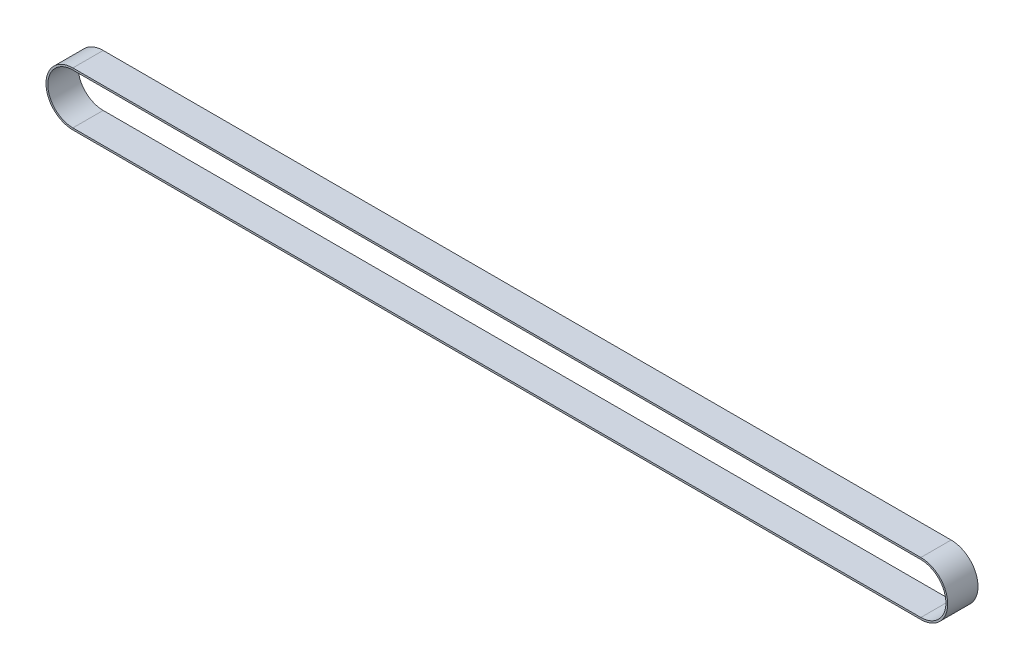
ISO-10303-21;
HEADER;
FILE_DESCRIPTION(('STEP AP214'),'2;1');
FILE_NAME('part.step','',(''),(''),'','','');
FILE_SCHEMA(('AUTOMOTIVE_DESIGN { 1 0 10303 214 1 1 1 1 }'));
ENDSEC;
DATA;
#1=APPLICATION_CONTEXT('core data for automotive mechanical design processes');
#2=APPLICATION_PROTOCOL_DEFINITION('international standard','automotive_design',2000,#1);
#3=PRODUCT_CONTEXT('',#1,'mechanical');
#4=PRODUCT('Part','Part','',(#3));
#5=PRODUCT_RELATED_PRODUCT_CATEGORY('part','',(#4));
#6=PRODUCT_DEFINITION_FORMATION('','',#4);
#7=PRODUCT_DEFINITION_CONTEXT('part definition',#1,'design');
#8=PRODUCT_DEFINITION('design','',#6,#7);
#9=PRODUCT_DEFINITION_SHAPE('','',#8);
#10=(LENGTH_UNIT() NAMED_UNIT(*) SI_UNIT(.MILLI.,.METRE.));
#11=(NAMED_UNIT(*) PLANE_ANGLE_UNIT() SI_UNIT($,.RADIAN.));
#12=(NAMED_UNIT(*) SI_UNIT($,.STERADIAN.) SOLID_ANGLE_UNIT());
#13=UNCERTAINTY_MEASURE_WITH_UNIT(LENGTH_MEASURE(1.E-05),#10,'distance_accuracy_value','');
#14=(GEOMETRIC_REPRESENTATION_CONTEXT(3) GLOBAL_UNCERTAINTY_ASSIGNED_CONTEXT((#13)) GLOBAL_UNIT_ASSIGNED_CONTEXT((#10,
#11,#12)) REPRESENTATION_CONTEXT('',''));
#15=CARTESIAN_POINT('',(0.,0.,0.));
#16=DIRECTION('',(0.,0.,1.));
#17=DIRECTION('',(1.,0.,0.));
#18=AXIS2_PLACEMENT_3D('',#15,#16,#17);
#19=CARTESIAN_POINT('',(0.,0.,25.));
#20=DIRECTION('',(0.,0.,1.));
#21=DIRECTION('',(1.,0.,0.));
#22=AXIS2_PLACEMENT_3D('',#19,#20,#21);
#23=PLANE('',#22);
#24=CARTESIAN_POINT('',(0.,0.,25.));
#25=DIRECTION('',(0.,0.,1.));
#26=DIRECTION('',(1.,0.,0.));
#27=AXIS2_PLACEMENT_3D('',#24,#25,#26);
#28=CIRCLE('',#27,22.19);
#29=CARTESIAN_POINT('',(0.,22.19,25.));
#30=VERTEX_POINT('',#29);
#31=CARTESIAN_POINT('',(0.,-22.19,25.));
#32=VERTEX_POINT('',#31);
#33=EDGE_CURVE('E180',#30,#32,#28,.T.);
#34=ORIENTED_EDGE('',*,*,#33,.T.);
#35=DIRECTION('',(1.,0.,0.));
#36=VECTOR('',#35,1.);
#37=CARTESIAN_POINT('',(0.,-22.19,25.));
#38=LINE('',#37,#36);
#39=CARTESIAN_POINT('',(700.,-22.19,25.));
#40=VERTEX_POINT('',#39);
#41=EDGE_CURVE('E184',#32,#40,#38,.T.);
#42=ORIENTED_EDGE('',*,*,#41,.T.);
#43=CARTESIAN_POINT('',(700.,0.,25.));
#44=DIRECTION('',(0.,0.,1.));
#45=DIRECTION('',(1.,0.,0.));
#46=AXIS2_PLACEMENT_3D('',#43,#44,#45);
#47=CIRCLE('',#46,22.19);
#48=CARTESIAN_POINT('',(700.,22.19,25.));
#49=VERTEX_POINT('',#48);
#50=EDGE_CURVE('E188',#40,#49,#47,.T.);
#51=ORIENTED_EDGE('',*,*,#50,.T.);
#52=DIRECTION('',(-1.,0.,0.));
#53=VECTOR('',#52,1.);
#54=CARTESIAN_POINT('',(0.,22.19,25.));
#55=LINE('',#54,#53);
#56=EDGE_CURVE('E191',#49,#30,#55,.T.);
#57=ORIENTED_EDGE('',*,*,#56,.T.);
#58=EDGE_LOOP('',(#34,#42,#51,#57));
#59=FACE_BOUND('',#58,.T.);
#60=DIRECTION('',(1.,0.,0.));
#61=VECTOR('',#60,1.);
#62=CARTESIAN_POINT('',(0.,-20.69,25.));
#63=LINE('',#62,#61);
#64=CARTESIAN_POINT('',(0.,-20.69,25.));
#65=VERTEX_POINT('',#64);
#66=CARTESIAN_POINT('',(700.,-20.69,25.));
#67=VERTEX_POINT('',#66);
#68=EDGE_CURVE('E141',#65,#67,#63,.T.);
#69=ORIENTED_EDGE('',*,*,#68,.F.);
#70=CARTESIAN_POINT('',(0.,0.,25.));
#71=DIRECTION('',(0.,0.,1.));
#72=DIRECTION('',(1.,0.,0.));
#73=AXIS2_PLACEMENT_3D('',#70,#71,#72);
#74=CIRCLE('',#73,20.69);
#75=CARTESIAN_POINT('',(0.,20.69,25.));
#76=VERTEX_POINT('',#75);
#77=EDGE_CURVE('E132',#76,#65,#74,.T.);
#78=ORIENTED_EDGE('',*,*,#77,.F.);
#79=DIRECTION('',(-1.,0.,0.));
#80=VECTOR('',#79,1.);
#81=CARTESIAN_POINT('',(0.,20.69,25.));
#82=LINE('',#81,#80);
#83=CARTESIAN_POINT('',(700.,20.69,25.));
#84=VERTEX_POINT('',#83);
#85=EDGE_CURVE('E158',#84,#76,#82,.T.);
#86=ORIENTED_EDGE('',*,*,#85,.F.);
#87=CARTESIAN_POINT('',(700.,0.,25.));
#88=DIRECTION('',(0.,0.,1.));
#89=DIRECTION('',(1.,0.,0.));
#90=AXIS2_PLACEMENT_3D('',#87,#88,#89);
#91=CIRCLE('',#90,20.69);
#92=EDGE_CURVE('E154',#67,#84,#91,.T.);
#93=ORIENTED_EDGE('',*,*,#92,.F.);
#94=EDGE_LOOP('',(#69,#78,#86,#93));
#95=FACE_BOUND('',#94,.T.);
#96=ADVANCED_FACE('F66',(#59,#95),#23,.T.);
#97=CARTESIAN_POINT('',(0.,0.,0.));
#98=DIRECTION('',(0.,0.,1.));
#99=DIRECTION('',(1.,0.,0.));
#100=AXIS2_PLACEMENT_3D('',#97,#98,#99);
#101=PLANE('',#100);
#102=CARTESIAN_POINT('',(0.,0.,0.));
#103=DIRECTION('',(0.,0.,1.));
#104=DIRECTION('',(1.,0.,0.));
#105=AXIS2_PLACEMENT_3D('',#102,#103,#104);
#106=CIRCLE('',#105,22.19);
#107=CARTESIAN_POINT('',(0.,22.19,0.));
#108=VERTEX_POINT('',#107);
#109=CARTESIAN_POINT('',(0.,-22.19,0.));
#110=VERTEX_POINT('',#109);
#111=EDGE_CURVE('E150',#108,#110,#106,.T.);
#112=ORIENTED_EDGE('',*,*,#111,.F.);
#113=DIRECTION('',(-1.,0.,0.));
#114=VECTOR('',#113,1.);
#115=CARTESIAN_POINT('',(0.,22.19,0.));
#116=LINE('',#115,#114);
#117=CARTESIAN_POINT('',(700.,22.19,0.));
#118=VERTEX_POINT('',#117);
#119=EDGE_CURVE('E185',#118,#108,#116,.T.);
#120=ORIENTED_EDGE('',*,*,#119,.F.);
#121=CARTESIAN_POINT('',(700.,0.,0.));
#122=DIRECTION('',(0.,0.,1.));
#123=DIRECTION('',(1.,0.,0.));
#124=AXIS2_PLACEMENT_3D('',#121,#122,#123);
#125=CIRCLE('',#124,22.19);
#126=CARTESIAN_POINT('',(700.,-22.19,0.));
#127=VERTEX_POINT('',#126);
#128=EDGE_CURVE('E201',#127,#118,#125,.T.);
#129=ORIENTED_EDGE('',*,*,#128,.F.);
#130=DIRECTION('',(1.,0.,0.));
#131=VECTOR('',#130,1.);
#132=CARTESIAN_POINT('',(0.,-22.19,0.));
#133=LINE('',#132,#131);
#134=EDGE_CURVE('E198',#110,#127,#133,.T.);
#135=ORIENTED_EDGE('',*,*,#134,.F.);
#136=EDGE_LOOP('',(#112,#120,#129,#135));
#137=FACE_BOUND('',#136,.T.);
#138=CARTESIAN_POINT('',(0.,0.,0.));
#139=DIRECTION('',(0.,0.,1.));
#140=DIRECTION('',(1.,0.,0.));
#141=AXIS2_PLACEMENT_3D('',#138,#139,#140);
#142=CIRCLE('',#141,20.69);
#143=CARTESIAN_POINT('',(0.,20.69,0.));
#144=VERTEX_POINT('',#143);
#145=CARTESIAN_POINT('',(0.,-20.69,0.));
#146=VERTEX_POINT('',#145);
#147=EDGE_CURVE('E90',#144,#146,#142,.T.);
#148=ORIENTED_EDGE('',*,*,#147,.T.);
#149=DIRECTION('',(1.,0.,0.));
#150=VECTOR('',#149,1.);
#151=CARTESIAN_POINT('',(0.,-20.69,0.));
#152=LINE('',#151,#150);
#153=CARTESIAN_POINT('',(700.,-20.69,0.));
#154=VERTEX_POINT('',#153);
#155=EDGE_CURVE('E148',#146,#154,#152,.T.);
#156=ORIENTED_EDGE('',*,*,#155,.T.);
#157=CARTESIAN_POINT('',(700.,0.,0.));
#158=DIRECTION('',(0.,0.,1.));
#159=DIRECTION('',(1.,0.,0.));
#160=AXIS2_PLACEMENT_3D('',#157,#158,#159);
#161=CIRCLE('',#160,20.69);
#162=CARTESIAN_POINT('',(700.,20.69,0.));
#163=VERTEX_POINT('',#162);
#164=EDGE_CURVE('E167',#154,#163,#161,.T.);
#165=ORIENTED_EDGE('',*,*,#164,.T.);
#166=DIRECTION('',(-1.,0.,0.));
#167=VECTOR('',#166,1.);
#168=CARTESIAN_POINT('',(0.,20.69,0.));
#169=LINE('',#168,#167);
#170=EDGE_CURVE('E142',#163,#144,#169,.T.);
#171=ORIENTED_EDGE('',*,*,#170,.T.);
#172=EDGE_LOOP('',(#148,#156,#165,#171));
#173=FACE_BOUND('',#172,.T.);
#174=ADVANCED_FACE('F224',(#137,#173),#101,.F.);
#175=CARTESIAN_POINT('',(0.,0.,25.));
#176=DIRECTION('',(0.,0.,-1.));
#177=DIRECTION('',(-1.,0.,0.));
#178=AXIS2_PLACEMENT_3D('',#175,#176,#177);
#179=CYLINDRICAL_SURFACE('',#178,22.19);
#180=ORIENTED_EDGE('',*,*,#111,.T.);
#181=DIRECTION('',(0.,0.,-1.));
#182=VECTOR('',#181,1.);
#183=CARTESIAN_POINT('',(0.,-22.19,25.));
#184=LINE('',#183,#182);
#185=EDGE_CURVE('E12',#32,#110,#184,.T.);
#186=ORIENTED_EDGE('',*,*,#185,.F.);
#187=ORIENTED_EDGE('',*,*,#33,.F.);
#188=DIRECTION('',(0.,0.,-1.));
#189=VECTOR('',#188,1.);
#190=CARTESIAN_POINT('',(0.,22.19,25.));
#191=LINE('',#190,#189);
#192=EDGE_CURVE('E194',#30,#108,#191,.T.);
#193=ORIENTED_EDGE('',*,*,#192,.T.);
#194=EDGE_LOOP('',(#180,#186,#187,#193));
#195=FACE_BOUND('',#194,.T.);
#196=ADVANCED_FACE('F68',(#195),#179,.T.);
#197=CARTESIAN_POINT('',(0.,-22.19,25.));
#198=DIRECTION('',(0.,1.,0.));
#199=DIRECTION('',(-1.,0.,0.));
#200=AXIS2_PLACEMENT_3D('',#197,#198,#199);
#201=PLANE('',#200);
#202=ORIENTED_EDGE('',*,*,#134,.T.);
#203=DIRECTION('',(0.,0.,-1.));
#204=VECTOR('',#203,1.);
#205=CARTESIAN_POINT('',(700.,-22.19,25.));
#206=LINE('',#205,#204);
#207=EDGE_CURVE('E75',#40,#127,#206,.T.);
#208=ORIENTED_EDGE('',*,*,#207,.F.);
#209=ORIENTED_EDGE('',*,*,#41,.F.);
#210=ORIENTED_EDGE('',*,*,#185,.T.);
#211=EDGE_LOOP('',(#202,#208,#209,#210));
#212=FACE_BOUND('',#211,.T.);
#213=ADVANCED_FACE('F234',(#212),#201,.F.);
#214=CARTESIAN_POINT('',(700.,0.,25.));
#215=DIRECTION('',(0.,0.,-1.));
#216=DIRECTION('',(-1.,0.,0.));
#217=AXIS2_PLACEMENT_3D('',#214,#215,#216);
#218=CYLINDRICAL_SURFACE('',#217,22.19);
#219=ORIENTED_EDGE('',*,*,#128,.T.);
#220=DIRECTION('',(0.,0.,-1.));
#221=VECTOR('',#220,1.);
#222=CARTESIAN_POINT('',(700.,22.19,25.));
#223=LINE('',#222,#221);
#224=EDGE_CURVE('E209',#49,#118,#223,.T.);
#225=ORIENTED_EDGE('',*,*,#224,.F.);
#226=ORIENTED_EDGE('',*,*,#50,.F.);
#227=ORIENTED_EDGE('',*,*,#207,.T.);
#228=EDGE_LOOP('',(#219,#225,#226,#227));
#229=FACE_BOUND('',#228,.T.);
#230=ADVANCED_FACE('F218',(#229),#218,.T.);
#231=CARTESIAN_POINT('',(0.,22.19,25.));
#232=DIRECTION('',(0.,-1.,0.));
#233=DIRECTION('',(1.,0.,0.));
#234=AXIS2_PLACEMENT_3D('',#231,#232,#233);
#235=PLANE('',#234);
#236=ORIENTED_EDGE('',*,*,#119,.T.);
#237=ORIENTED_EDGE('',*,*,#192,.F.);
#238=ORIENTED_EDGE('',*,*,#56,.F.);
#239=ORIENTED_EDGE('',*,*,#224,.T.);
#240=EDGE_LOOP('',(#236,#237,#238,#239));
#241=FACE_BOUND('',#240,.T.);
#242=ADVANCED_FACE('F228',(#241),#235,.F.);
#243=CARTESIAN_POINT('',(0.,0.,25.));
#244=DIRECTION('',(0.,0.,-1.));
#245=DIRECTION('',(-1.,0.,0.));
#246=AXIS2_PLACEMENT_3D('',#243,#244,#245);
#247=CYLINDRICAL_SURFACE('',#246,20.69);
#248=ORIENTED_EDGE('',*,*,#147,.F.);
#249=DIRECTION('',(0.,0.,-1.));
#250=VECTOR('',#249,1.);
#251=CARTESIAN_POINT('',(0.,20.69,25.));
#252=LINE('',#251,#250);
#253=EDGE_CURVE('E136',#76,#144,#252,.T.);
#254=ORIENTED_EDGE('',*,*,#253,.F.);
#255=ORIENTED_EDGE('',*,*,#77,.T.);
#256=DIRECTION('',(0.,0.,-1.));
#257=VECTOR('',#256,1.);
#258=CARTESIAN_POINT('',(0.,-20.69,25.));
#259=LINE('',#258,#257);
#260=EDGE_CURVE('E135',#65,#146,#259,.T.);
#261=ORIENTED_EDGE('',*,*,#260,.T.);
#262=EDGE_LOOP('',(#248,#254,#255,#261));
#263=FACE_BOUND('',#262,.T.);
#264=ADVANCED_FACE('F134',(#263),#247,.F.);
#265=CARTESIAN_POINT('',(0.,-20.69,25.));
#266=DIRECTION('',(0.,1.,0.));
#267=DIRECTION('',(-1.,0.,0.));
#268=AXIS2_PLACEMENT_3D('',#265,#266,#267);
#269=PLANE('',#268);
#270=ORIENTED_EDGE('',*,*,#155,.F.);
#271=ORIENTED_EDGE('',*,*,#260,.F.);
#272=ORIENTED_EDGE('',*,*,#68,.T.);
#273=DIRECTION('',(0.,0.,-1.));
#274=VECTOR('',#273,1.);
#275=CARTESIAN_POINT('',(700.,-20.69,25.));
#276=LINE('',#275,#274);
#277=EDGE_CURVE('E151',#67,#154,#276,.T.);
#278=ORIENTED_EDGE('',*,*,#277,.T.);
#279=EDGE_LOOP('',(#270,#271,#272,#278));
#280=FACE_BOUND('',#279,.T.);
#281=ADVANCED_FACE('F145',(#280),#269,.T.);
#282=CARTESIAN_POINT('',(700.,0.,25.));
#283=DIRECTION('',(0.,0.,-1.));
#284=DIRECTION('',(-1.,0.,0.));
#285=AXIS2_PLACEMENT_3D('',#282,#283,#284);
#286=CYLINDRICAL_SURFACE('',#285,20.69);
#287=ORIENTED_EDGE('',*,*,#164,.F.);
#288=ORIENTED_EDGE('',*,*,#277,.F.);
#289=ORIENTED_EDGE('',*,*,#92,.T.);
#290=DIRECTION('',(0.,0.,-1.));
#291=VECTOR('',#290,1.);
#292=CARTESIAN_POINT('',(700.,20.69,25.));
#293=LINE('',#292,#291);
#294=EDGE_CURVE('E82',#84,#163,#293,.T.);
#295=ORIENTED_EDGE('',*,*,#294,.T.);
#296=EDGE_LOOP('',(#287,#288,#289,#295));
#297=FACE_BOUND('',#296,.T.);
#298=ADVANCED_FACE('F257',(#297),#286,.F.);
#299=CARTESIAN_POINT('',(0.,20.69,25.));
#300=DIRECTION('',(0.,-1.,0.));
#301=DIRECTION('',(1.,0.,0.));
#302=AXIS2_PLACEMENT_3D('',#299,#300,#301);
#303=PLANE('',#302);
#304=ORIENTED_EDGE('',*,*,#170,.F.);
#305=ORIENTED_EDGE('',*,*,#294,.F.);
#306=ORIENTED_EDGE('',*,*,#85,.T.);
#307=ORIENTED_EDGE('',*,*,#253,.T.);
#308=EDGE_LOOP('',(#304,#305,#306,#307));
#309=FACE_BOUND('',#308,.T.);
#310=ADVANCED_FACE('F261',(#309),#303,.T.);
#311=CLOSED_SHELL('',(#96,#174,#196,#213,#230,#242,#264,#281,#298,#310));
#312=MANIFOLD_SOLID_BREP('B2',#311);
#313=ADVANCED_BREP_SHAPE_REPRESENTATION('',(#18,#312),#14);
#314=SHAPE_DEFINITION_REPRESENTATION(#9,#313);
ENDSEC;
END-ISO-10303-21;
